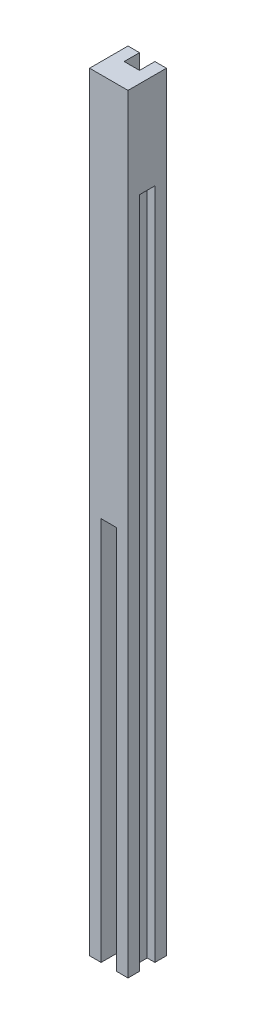
ISO-10303-21;
HEADER;
FILE_DESCRIPTION(('STEP AP214'),'2;1');
FILE_NAME('part.step','',(''),(''),'','','');
FILE_SCHEMA(('AUTOMOTIVE_DESIGN { 1 0 10303 214 1 1 1 1 }'));
ENDSEC;
DATA;
#1=APPLICATION_CONTEXT('core data for automotive mechanical design processes');
#2=APPLICATION_PROTOCOL_DEFINITION('international standard','automotive_design',2000,#1);
#3=PRODUCT_CONTEXT('',#1,'mechanical');
#4=PRODUCT('Part','Part','',(#3));
#5=PRODUCT_RELATED_PRODUCT_CATEGORY('part','',(#4));
#6=PRODUCT_DEFINITION_FORMATION('','',#4);
#7=PRODUCT_DEFINITION_CONTEXT('part definition',#1,'design');
#8=PRODUCT_DEFINITION('design','',#6,#7);
#9=PRODUCT_DEFINITION_SHAPE('','',#8);
#10=(LENGTH_UNIT() NAMED_UNIT(*) SI_UNIT(.MILLI.,.METRE.));
#11=(NAMED_UNIT(*) PLANE_ANGLE_UNIT() SI_UNIT($,.RADIAN.));
#12=(NAMED_UNIT(*) SI_UNIT($,.STERADIAN.) SOLID_ANGLE_UNIT());
#13=UNCERTAINTY_MEASURE_WITH_UNIT(LENGTH_MEASURE(1.E-05),#10,'distance_accuracy_value','');
#14=(GEOMETRIC_REPRESENTATION_CONTEXT(3) GLOBAL_UNCERTAINTY_ASSIGNED_CONTEXT((#13)) GLOBAL_UNIT_ASSIGNED_CONTEXT((#10,
#11,#12)) REPRESENTATION_CONTEXT('',''));
#15=CARTESIAN_POINT('',(0.,0.,0.));
#16=DIRECTION('',(0.,0.,1.));
#17=DIRECTION('',(1.,0.,0.));
#18=AXIS2_PLACEMENT_3D('',#15,#16,#17);
#19=CARTESIAN_POINT('',(0.,0.,0.));
#20=DIRECTION('',(0.,1.,0.));
#21=DIRECTION('',(0.,0.,1.));
#22=AXIS2_PLACEMENT_3D('',#19,#20,#21);
#23=PLANE('',#22);
#24=DIRECTION('',(-1.,0.,0.));
#25=VECTOR('',#24,1.);
#26=CARTESIAN_POINT('',(-23.4918902303552,0.,37.3055599747321));
#27=LINE('',#26,#25);
#28=CARTESIAN_POINT('',(-23.4918902303552,0.,37.3055599747321));
#29=VERTEX_POINT('',#28);
#30=CARTESIAN_POINT('',(-43.4918902303552,0.,37.3055599747321));
#31=VERTEX_POINT('',#30);
#32=EDGE_CURVE('E195',#29,#31,#27,.T.);
#33=ORIENTED_EDGE('',*,*,#32,.F.);
#34=DIRECTION('',(0.,0.,1.));
#35=VECTOR('',#34,1.);
#36=CARTESIAN_POINT('',(-23.4918902303552,0.,-2.69444002526795));
#37=LINE('',#36,#35);
#38=CARTESIAN_POINT('',(-23.4918902303552,0.,-2.69444002526795));
#39=VERTEX_POINT('',#38);
#40=EDGE_CURVE('E181',#39,#29,#37,.T.);
#41=ORIENTED_EDGE('',*,*,#40,.F.);
#42=DIRECTION('',(-1.,0.,0.));
#43=VECTOR('',#42,1.);
#44=CARTESIAN_POINT('',(-23.4918902303552,0.,-2.69444002526795));
#45=LINE('',#44,#43);
#46=CARTESIAN_POINT('',(-43.4918902303552,0.,-2.69444002526795));
#47=VERTEX_POINT('',#46);
#48=EDGE_CURVE('E200',#39,#47,#45,.T.);
#49=ORIENTED_EDGE('',*,*,#48,.T.);
#50=DIRECTION('',(0.,0.,1.));
#51=VECTOR('',#50,1.);
#52=CARTESIAN_POINT('',(-43.4918902303552,0.,-32.6944400252682));
#53=LINE('',#52,#51);
#54=CARTESIAN_POINT('',(-43.4918902303552,0.,-32.6944400252682));
#55=VERTEX_POINT('',#54);
#56=EDGE_CURVE('E295',#55,#47,#53,.T.);
#57=ORIENTED_EDGE('',*,*,#56,.F.);
#58=DIRECTION('',(-1.,0.,0.));
#59=VECTOR('',#58,1.);
#60=CARTESIAN_POINT('',(-43.4918902303552,0.,-32.6944400252682));
#61=LINE('',#60,#59);
#62=CARTESIAN_POINT('',(56.5081097696448,0.,-32.6944400252682));
#63=VERTEX_POINT('',#62);
#64=EDGE_CURVE('E286',#63,#55,#61,.T.);
#65=ORIENTED_EDGE('',*,*,#64,.F.);
#66=DIRECTION('',(0.,0.,-1.));
#67=VECTOR('',#66,1.);
#68=CARTESIAN_POINT('',(56.5081097696448,0.,-32.6944400252682));
#69=LINE('',#68,#67);
#70=CARTESIAN_POINT('',(56.5081097696448,0.,-2.69444002526838));
#71=VERTEX_POINT('',#70);
#72=EDGE_CURVE('E302',#71,#63,#69,.T.);
#73=ORIENTED_EDGE('',*,*,#72,.F.);
#74=DIRECTION('',(1.,0.,0.));
#75=VECTOR('',#74,1.);
#76=CARTESIAN_POINT('',(36.5081097696448,0.,-2.69444002526838));
#77=LINE('',#76,#75);
#78=CARTESIAN_POINT('',(36.5081097696448,0.,-2.69444002526838));
#79=VERTEX_POINT('',#78);
#80=EDGE_CURVE('E221',#79,#71,#77,.T.);
#81=ORIENTED_EDGE('',*,*,#80,.F.);
#82=DIRECTION('',(0.,0.,-1.));
#83=VECTOR('',#82,1.);
#84=CARTESIAN_POINT('',(36.5081097696448,0.,37.3055599747316));
#85=LINE('',#84,#83);
#86=CARTESIAN_POINT('',(36.5081097696448,0.,37.3055599747318));
#87=VERTEX_POINT('',#86);
#88=EDGE_CURVE('E210',#87,#79,#85,.T.);
#89=ORIENTED_EDGE('',*,*,#88,.F.);
#90=DIRECTION('',(1.,0.,0.));
#91=VECTOR('',#90,1.);
#92=CARTESIAN_POINT('',(36.5081097696448,0.,37.3055599747316));
#93=LINE('',#92,#91);
#94=CARTESIAN_POINT('',(56.5081097696448,0.,37.3055599747316));
#95=VERTEX_POINT('',#94);
#96=EDGE_CURVE('E218',#87,#95,#93,.T.);
#97=ORIENTED_EDGE('',*,*,#96,.T.);
#98=CARTESIAN_POINT('',(56.5081097696448,0.,67.3055599747318));
#99=VERTEX_POINT('',#98);
#100=EDGE_CURVE('E303',#99,#95,#69,.T.);
#101=ORIENTED_EDGE('',*,*,#100,.F.);
#102=DIRECTION('',(1.,0.,0.));
#103=VECTOR('',#102,1.);
#104=CARTESIAN_POINT('',(-43.4918902303552,0.,67.3055599747318));
#105=LINE('',#104,#103);
#106=CARTESIAN_POINT('',(26.508109769645,0.,67.3055599747318));
#107=VERTEX_POINT('',#106);
#108=EDGE_CURVE('E298',#107,#99,#105,.T.);
#109=ORIENTED_EDGE('',*,*,#108,.F.);
#110=DIRECTION('',(0.,0.,1.));
#111=VECTOR('',#110,1.);
#112=CARTESIAN_POINT('',(26.508109769645,0.,27.3055599747318));
#113=LINE('',#112,#111);
#114=CARTESIAN_POINT('',(26.508109769645,0.,27.3055599747318));
#115=VERTEX_POINT('',#114);
#116=EDGE_CURVE('E278',#115,#107,#113,.T.);
#117=ORIENTED_EDGE('',*,*,#116,.F.);
#118=DIRECTION('',(1.,0.,0.));
#119=VECTOR('',#118,1.);
#120=CARTESIAN_POINT('',(-13.491890230355,0.,27.3055599747318));
#121=LINE('',#120,#119);
#122=CARTESIAN_POINT('',(-13.4918902303552,0.,27.3055599747318));
#123=VERTEX_POINT('',#122);
#124=EDGE_CURVE('E258',#123,#115,#121,.T.);
#125=ORIENTED_EDGE('',*,*,#124,.F.);
#126=DIRECTION('',(0.,0.,1.));
#127=VECTOR('',#126,1.);
#128=CARTESIAN_POINT('',(-13.491890230355,0.,27.3055599747318));
#129=LINE('',#128,#127);
#130=CARTESIAN_POINT('',(-13.491890230355,0.,67.3055599747318));
#131=VERTEX_POINT('',#130);
#132=EDGE_CURVE('E266',#123,#131,#129,.T.);
#133=ORIENTED_EDGE('',*,*,#132,.T.);
#134=CARTESIAN_POINT('',(-43.4918902303552,0.,67.3055599747318));
#135=VERTEX_POINT('',#134);
#136=EDGE_CURVE('E299',#135,#131,#105,.T.);
#137=ORIENTED_EDGE('',*,*,#136,.F.);
#138=EDGE_CURVE('E275',#31,#135,#53,.T.);
#139=ORIENTED_EDGE('',*,*,#138,.F.);
#140=EDGE_LOOP('',(#33,#41,#49,#57,#65,#73,#81,#89,#97,#101,#109,#117,#125,#133,#137,#139));
#141=FACE_BOUND('',#140,.T.);
#142=ADVANCED_FACE('F34',(#141),#23,.F.);
#143=CARTESIAN_POINT('',(-43.4918902303552,2000.,-32.6944400252682));
#144=DIRECTION('',(1.,0.,0.));
#145=DIRECTION('',(0.,0.,-1.));
#146=AXIS2_PLACEMENT_3D('',#143,#144,#145);
#147=PLANE('',#146);
#148=DIRECTION('',(0.,-1.,0.));
#149=VECTOR('',#148,1.);
#150=CARTESIAN_POINT('',(-43.4918902303552,1750.,37.3055599747318));
#151=LINE('',#150,#149);
#152=CARTESIAN_POINT('',(-43.4918902303552,1750.,37.3055599747318));
#153=VERTEX_POINT('',#152);
#154=EDGE_CURVE('E193',#153,#31,#151,.T.);
#155=ORIENTED_EDGE('',*,*,#154,.T.);
#156=ORIENTED_EDGE('',*,*,#138,.T.);
#157=DIRECTION('',(0.,-1.,0.));
#158=VECTOR('',#157,1.);
#159=CARTESIAN_POINT('',(-43.4918902303552,2000.,67.3055599747318));
#160=LINE('',#159,#158);
#161=CARTESIAN_POINT('',(-43.4918902303552,2000.,67.3055599747318));
#162=VERTEX_POINT('',#161);
#163=EDGE_CURVE('E11',#162,#135,#160,.T.);
#164=ORIENTED_EDGE('',*,*,#163,.F.);
#165=DIRECTION('',(0.,0.,1.));
#166=VECTOR('',#165,1.);
#167=CARTESIAN_POINT('',(-43.4918902303552,2000.,-32.6944400252682));
#168=LINE('',#167,#166);
#169=CARTESIAN_POINT('',(-43.4918902303552,2000.,-32.6944400252682));
#170=VERTEX_POINT('',#169);
#171=EDGE_CURVE('E282',#170,#162,#168,.T.);
#172=ORIENTED_EDGE('',*,*,#171,.F.);
#173=DIRECTION('',(0.,-1.,0.));
#174=VECTOR('',#173,1.);
#175=CARTESIAN_POINT('',(-43.4918902303552,2000.,-32.6944400252682));
#176=LINE('',#175,#174);
#177=EDGE_CURVE('E294',#170,#55,#176,.T.);
#178=ORIENTED_EDGE('',*,*,#177,.T.);
#179=ORIENTED_EDGE('',*,*,#56,.T.);
#180=DIRECTION('',(0.,-1.,0.));
#181=VECTOR('',#180,1.);
#182=CARTESIAN_POINT('',(-43.4918902303552,1750.,-2.69444002526816));
#183=LINE('',#182,#181);
#184=CARTESIAN_POINT('',(-43.4918902303552,1750.,-2.69444002526816));
#185=VERTEX_POINT('',#184);
#186=EDGE_CURVE('E189',#185,#47,#183,.T.);
#187=ORIENTED_EDGE('',*,*,#186,.F.);
#188=DIRECTION('',(0.,0.,1.));
#189=VECTOR('',#188,1.);
#190=CARTESIAN_POINT('',(-43.4918902303552,1750.,-2.69444002526816));
#191=LINE('',#190,#189);
#192=EDGE_CURVE('E49',#185,#153,#191,.T.);
#193=ORIENTED_EDGE('',*,*,#192,.T.);
#194=EDGE_LOOP('',(#155,#156,#164,#172,#178,#179,#187,#193));
#195=FACE_BOUND('',#194,.T.);
#196=ADVANCED_FACE('F36',(#195),#147,.F.);
#197=CARTESIAN_POINT('',(56.5081097696448,2000.,-32.6944400252682));
#198=DIRECTION('',(-1.,0.,0.));
#199=DIRECTION('',(0.,0.,1.));
#200=AXIS2_PLACEMENT_3D('',#197,#198,#199);
#201=PLANE('',#200);
#202=DIRECTION('',(0.,-1.,0.));
#203=VECTOR('',#202,1.);
#204=CARTESIAN_POINT('',(56.5081097696448,1750.,-2.69444002526817));
#205=LINE('',#204,#203);
#206=CARTESIAN_POINT('',(56.5081097696448,1750.,-2.69444002526817));
#207=VERTEX_POINT('',#206);
#208=EDGE_CURVE('E198',#207,#71,#205,.T.);
#209=ORIENTED_EDGE('',*,*,#208,.T.);
#210=ORIENTED_EDGE('',*,*,#72,.T.);
#211=DIRECTION('',(0.,-1.,0.));
#212=VECTOR('',#211,1.);
#213=CARTESIAN_POINT('',(56.5081097696448,2000.,-32.6944400252682));
#214=LINE('',#213,#212);
#215=CARTESIAN_POINT('',(56.5081097696448,2000.,-32.6944400252682));
#216=VERTEX_POINT('',#215);
#217=EDGE_CURVE('E309',#216,#63,#214,.T.);
#218=ORIENTED_EDGE('',*,*,#217,.F.);
#219=DIRECTION('',(0.,0.,-1.));
#220=VECTOR('',#219,1.);
#221=CARTESIAN_POINT('',(56.5081097696448,2000.,-32.6944400252682));
#222=LINE('',#221,#220);
#223=CARTESIAN_POINT('',(56.5081097696448,2000.,67.3055599747318));
#224=VERTEX_POINT('',#223);
#225=EDGE_CURVE('E288',#224,#216,#222,.T.);
#226=ORIENTED_EDGE('',*,*,#225,.F.);
#227=DIRECTION('',(0.,-1.,0.));
#228=VECTOR('',#227,1.);
#229=CARTESIAN_POINT('',(56.5081097696448,2000.,67.3055599747318));
#230=LINE('',#229,#228);
#231=EDGE_CURVE('E42',#224,#99,#230,.T.);
#232=ORIENTED_EDGE('',*,*,#231,.T.);
#233=ORIENTED_EDGE('',*,*,#100,.T.);
#234=DIRECTION('',(0.,-1.,0.));
#235=VECTOR('',#234,1.);
#236=CARTESIAN_POINT('',(56.5081097696448,1750.,37.3055599747318));
#237=LINE('',#236,#235);
#238=CARTESIAN_POINT('',(56.5081097696448,1750.,37.3055599747318));
#239=VERTEX_POINT('',#238);
#240=EDGE_CURVE('E208',#239,#95,#237,.T.);
#241=ORIENTED_EDGE('',*,*,#240,.F.);
#242=DIRECTION('',(0.,0.,-1.));
#243=VECTOR('',#242,1.);
#244=CARTESIAN_POINT('',(56.5081097696448,1750.,37.3055599747318));
#245=LINE('',#244,#243);
#246=EDGE_CURVE('E194',#239,#207,#245,.T.);
#247=ORIENTED_EDGE('',*,*,#246,.T.);
#248=EDGE_LOOP('',(#209,#210,#218,#226,#232,#233,#241,#247));
#249=FACE_BOUND('',#248,.T.);
#250=ADVANCED_FACE('F316',(#249),#201,.F.);
#251=CARTESIAN_POINT('',(-43.4918902303552,2000.,67.3055599747318));
#252=DIRECTION('',(0.,0.,-1.));
#253=DIRECTION('',(-1.,0.,0.));
#254=AXIS2_PLACEMENT_3D('',#251,#252,#253);
#255=PLANE('',#254);
#256=ORIENTED_EDGE('',*,*,#136,.T.);
#257=DIRECTION('',(0.,-1.,0.));
#258=VECTOR('',#257,1.);
#259=CARTESIAN_POINT('',(-13.4918902303552,1000.,67.3055599747318));
#260=LINE('',#259,#258);
#261=CARTESIAN_POINT('',(-13.4918902303552,1000.,67.3055599747318));
#262=VERTEX_POINT('',#261);
#263=EDGE_CURVE('E249',#262,#131,#260,.T.);
#264=ORIENTED_EDGE('',*,*,#263,.F.);
#265=DIRECTION('',(1.,0.,0.));
#266=VECTOR('',#265,1.);
#267=CARTESIAN_POINT('',(-13.4918902303552,1000.,67.3055599747318));
#268=LINE('',#267,#266);
#269=CARTESIAN_POINT('',(26.5081097696449,1000.,67.3055599747318));
#270=VERTEX_POINT('',#269);
#271=EDGE_CURVE('E259',#262,#270,#268,.T.);
#272=ORIENTED_EDGE('',*,*,#271,.T.);
#273=DIRECTION('',(0.,-1.,0.));
#274=VECTOR('',#273,1.);
#275=CARTESIAN_POINT('',(26.5081097696449,1000.,67.3055599747318));
#276=LINE('',#275,#274);
#277=EDGE_CURVE('E268',#270,#107,#276,.T.);
#278=ORIENTED_EDGE('',*,*,#277,.T.);
#279=ORIENTED_EDGE('',*,*,#108,.T.);
#280=ORIENTED_EDGE('',*,*,#231,.F.);
#281=DIRECTION('',(1.,0.,0.));
#282=VECTOR('',#281,1.);
#283=CARTESIAN_POINT('',(-43.4918902303552,2000.,67.3055599747318));
#284=LINE('',#283,#282);
#285=EDGE_CURVE('E285',#162,#224,#284,.T.);
#286=ORIENTED_EDGE('',*,*,#285,.F.);
#287=ORIENTED_EDGE('',*,*,#163,.T.);
#288=EDGE_LOOP('',(#256,#264,#272,#278,#279,#280,#286,#287));
#289=FACE_BOUND('',#288,.T.);
#290=ADVANCED_FACE('F347',(#289),#255,.F.);
#291=CARTESIAN_POINT('',(-43.4918902303552,2000.,-32.6944400252682));
#292=DIRECTION('',(0.,0.,1.));
#293=DIRECTION('',(1.,0.,0.));
#294=AXIS2_PLACEMENT_3D('',#291,#292,#293);
#295=PLANE('',#294);
#296=DIRECTION('',(-1.,0.,0.));
#297=VECTOR('',#296,1.);
#298=CARTESIAN_POINT('',(26.5081097696447,1000.,-32.6944400252682));
#299=LINE('',#298,#297);
#300=CARTESIAN_POINT('',(26.5081097696447,1000.,-32.6944400252682));
#301=VERTEX_POINT('',#300);
#302=CARTESIAN_POINT('',(-13.4918902303553,1000.,-32.6944400252682));
#303=VERTEX_POINT('',#302);
#304=EDGE_CURVE('E226',#301,#303,#299,.T.);
#305=ORIENTED_EDGE('',*,*,#304,.F.);
#306=DIRECTION('',(0.,-1.,0.));
#307=VECTOR('',#306,1.);
#308=CARTESIAN_POINT('',(26.5081097696448,2000.,-32.6944400252682));
#309=LINE('',#308,#307);
#310=CARTESIAN_POINT('',(26.5081097696448,2000.,-32.6944400252682));
#311=VERTEX_POINT('',#310);
#312=EDGE_CURVE('E231',#311,#301,#309,.T.);
#313=ORIENTED_EDGE('',*,*,#312,.F.);
#314=DIRECTION('',(-1.,0.,0.));
#315=VECTOR('',#314,1.);
#316=CARTESIAN_POINT('',(-43.4918902303552,2000.,-32.6944400252682));
#317=LINE('',#316,#315);
#318=EDGE_CURVE('E291',#216,#311,#317,.T.);
#319=ORIENTED_EDGE('',*,*,#318,.F.);
#320=ORIENTED_EDGE('',*,*,#217,.T.);
#321=ORIENTED_EDGE('',*,*,#64,.T.);
#322=ORIENTED_EDGE('',*,*,#177,.F.);
#323=CARTESIAN_POINT('',(-13.4918902303552,2000.,-32.6944400252682));
#324=VERTEX_POINT('',#323);
#325=EDGE_CURVE('E290',#324,#170,#317,.T.);
#326=ORIENTED_EDGE('',*,*,#325,.F.);
#327=DIRECTION('',(0.,-1.,0.));
#328=VECTOR('',#327,1.);
#329=CARTESIAN_POINT('',(-13.4918902303552,2000.,-32.6944400252682));
#330=LINE('',#329,#328);
#331=EDGE_CURVE('E242',#324,#303,#330,.T.);
#332=ORIENTED_EDGE('',*,*,#331,.T.);
#333=EDGE_LOOP('',(#305,#313,#319,#320,#321,#322,#326,#332));
#334=FACE_BOUND('',#333,.T.);
#335=ADVANCED_FACE('F339',(#334),#295,.F.);
#336=CARTESIAN_POINT('',(0.,2000.,0.));
#337=DIRECTION('',(0.,1.,0.));
#338=DIRECTION('',(0.,0.,1.));
#339=AXIS2_PLACEMENT_3D('',#336,#337,#338);
#340=PLANE('',#339);
#341=DIRECTION('',(0.,0.,-1.));
#342=VECTOR('',#341,1.);
#343=CARTESIAN_POINT('',(26.5081097696448,2000.,7.30555997473184));
#344=LINE('',#343,#342);
#345=CARTESIAN_POINT('',(26.5081097696448,2000.,7.30555997473184));
#346=VERTEX_POINT('',#345);
#347=EDGE_CURVE('E250',#346,#311,#344,.T.);
#348=ORIENTED_EDGE('',*,*,#347,.F.);
#349=DIRECTION('',(-1.,0.,0.));
#350=VECTOR('',#349,1.);
#351=CARTESIAN_POINT('',(26.5081097696448,2000.,7.30555997473184));
#352=LINE('',#351,#350);
#353=CARTESIAN_POINT('',(-13.4918902303553,2000.,7.30555997473184));
#354=VERTEX_POINT('',#353);
#355=EDGE_CURVE('E233',#346,#354,#352,.T.);
#356=ORIENTED_EDGE('',*,*,#355,.T.);
#357=DIRECTION('',(0.,0.,-1.));
#358=VECTOR('',#357,1.);
#359=CARTESIAN_POINT('',(-13.4918902303552,2000.,7.30555997473184));
#360=LINE('',#359,#358);
#361=EDGE_CURVE('E252',#354,#324,#360,.T.);
#362=ORIENTED_EDGE('',*,*,#361,.T.);
#363=ORIENTED_EDGE('',*,*,#325,.T.);
#364=ORIENTED_EDGE('',*,*,#171,.T.);
#365=ORIENTED_EDGE('',*,*,#285,.T.);
#366=ORIENTED_EDGE('',*,*,#225,.T.);
#367=ORIENTED_EDGE('',*,*,#318,.T.);
#368=EDGE_LOOP('',(#348,#356,#362,#363,#364,#365,#366,#367));
#369=FACE_BOUND('',#368,.T.);
#370=ADVANCED_FACE('F344',(#369),#340,.T.);
#371=CARTESIAN_POINT('',(-13.4918902303552,1000.,27.3055599747318));
#372=DIRECTION('',(-1.,0.,0.));
#373=DIRECTION('',(0.,-1.,0.));
#374=AXIS2_PLACEMENT_3D('',#371,#372,#373);
#375=PLANE('',#374);
#376=ORIENTED_EDGE('',*,*,#263,.T.);
#377=ORIENTED_EDGE('',*,*,#132,.F.);
#378=DIRECTION('',(0.,-1.,0.));
#379=VECTOR('',#378,1.);
#380=CARTESIAN_POINT('',(-13.4918902303552,1000.,27.3055599747318));
#381=LINE('',#380,#379);
#382=CARTESIAN_POINT('',(-13.4918902303552,1000.,27.3055599747318));
#383=VERTEX_POINT('',#382);
#384=EDGE_CURVE('E256',#383,#123,#381,.T.);
#385=ORIENTED_EDGE('',*,*,#384,.F.);
#386=DIRECTION('',(0.,0.,1.));
#387=VECTOR('',#386,1.);
#388=CARTESIAN_POINT('',(-13.4918902303552,1000.,27.3055599747318));
#389=LINE('',#388,#387);
#390=EDGE_CURVE('E273',#383,#262,#389,.T.);
#391=ORIENTED_EDGE('',*,*,#390,.T.);
#392=EDGE_LOOP('',(#376,#377,#385,#391));
#393=FACE_BOUND('',#392,.T.);
#394=ADVANCED_FACE('F356',(#393),#375,.F.);
#395=CARTESIAN_POINT('',(-13.4918902303552,1000.,27.3055599747318));
#396=DIRECTION('',(0.,-1.,0.));
#397=DIRECTION('',(0.,0.,-1.));
#398=AXIS2_PLACEMENT_3D('',#395,#396,#397);
#399=PLANE('',#398);
#400=ORIENTED_EDGE('',*,*,#271,.F.);
#401=ORIENTED_EDGE('',*,*,#390,.F.);
#402=DIRECTION('',(1.,0.,0.));
#403=VECTOR('',#402,1.);
#404=CARTESIAN_POINT('',(-13.4918902303552,1000.,27.3055599747318));
#405=LINE('',#404,#403);
#406=CARTESIAN_POINT('',(26.5081097696449,1000.,27.3055599747318));
#407=VERTEX_POINT('',#406);
#408=EDGE_CURVE('E264',#383,#407,#405,.T.);
#409=ORIENTED_EDGE('',*,*,#408,.T.);
#410=DIRECTION('',(0.,0.,1.));
#411=VECTOR('',#410,1.);
#412=CARTESIAN_POINT('',(26.5081097696449,1000.,27.3055599747318));
#413=LINE('',#412,#411);
#414=EDGE_CURVE('E276',#407,#270,#413,.T.);
#415=ORIENTED_EDGE('',*,*,#414,.T.);
#416=EDGE_LOOP('',(#400,#401,#409,#415));
#417=FACE_BOUND('',#416,.T.);
#418=ADVANCED_FACE('F360',(#417),#399,.T.);
#419=CARTESIAN_POINT('',(26.5081097696449,1000.,27.3055599747318));
#420=DIRECTION('',(-1.,0.,0.));
#421=DIRECTION('',(0.,-1.,0.));
#422=AXIS2_PLACEMENT_3D('',#419,#420,#421);
#423=PLANE('',#422);
#424=ORIENTED_EDGE('',*,*,#277,.F.);
#425=ORIENTED_EDGE('',*,*,#414,.F.);
#426=DIRECTION('',(0.,-1.,0.));
#427=VECTOR('',#426,1.);
#428=CARTESIAN_POINT('',(26.5081097696449,1000.,27.3055599747318));
#429=LINE('',#428,#427);
#430=EDGE_CURVE('E262',#407,#115,#429,.T.);
#431=ORIENTED_EDGE('',*,*,#430,.T.);
#432=ORIENTED_EDGE('',*,*,#116,.T.);
#433=EDGE_LOOP('',(#424,#425,#431,#432));
#434=FACE_BOUND('',#433,.T.);
#435=ADVANCED_FACE('F365',(#434),#423,.T.);
#436=CARTESIAN_POINT('',(0.,0.,27.3055599747318));
#437=DIRECTION('',(0.,0.,1.));
#438=DIRECTION('',(1.,0.,0.));
#439=AXIS2_PLACEMENT_3D('',#436,#437,#438);
#440=PLANE('',#439);
#441=ORIENTED_EDGE('',*,*,#384,.T.);
#442=ORIENTED_EDGE('',*,*,#124,.T.);
#443=ORIENTED_EDGE('',*,*,#430,.F.);
#444=ORIENTED_EDGE('',*,*,#408,.F.);
#445=EDGE_LOOP('',(#441,#442,#443,#444));
#446=FACE_BOUND('',#445,.T.);
#447=ADVANCED_FACE('F367',(#446),#440,.T.);
#448=CARTESIAN_POINT('',(26.5081097696447,1000.,7.30555997473184));
#449=DIRECTION('',(0.,-1.,0.));
#450=DIRECTION('',(0.,0.,-1.));
#451=AXIS2_PLACEMENT_3D('',#448,#449,#450);
#452=PLANE('',#451);
#453=ORIENTED_EDGE('',*,*,#304,.T.);
#454=DIRECTION('',(0.,0.,-1.));
#455=VECTOR('',#454,1.);
#456=CARTESIAN_POINT('',(-13.4918902303553,1000.,7.30555997473184));
#457=LINE('',#456,#455);
#458=CARTESIAN_POINT('',(-13.4918902303553,1000.,7.30555997473184));
#459=VERTEX_POINT('',#458);
#460=EDGE_CURVE('E239',#459,#303,#457,.T.);
#461=ORIENTED_EDGE('',*,*,#460,.F.);
#462=DIRECTION('',(-1.,0.,0.));
#463=VECTOR('',#462,1.);
#464=CARTESIAN_POINT('',(26.5081097696447,1000.,7.30555997473184));
#465=LINE('',#464,#463);
#466=CARTESIAN_POINT('',(26.5081097696447,1000.,7.30555997473184));
#467=VERTEX_POINT('',#466);
#468=EDGE_CURVE('E227',#467,#459,#465,.T.);
#469=ORIENTED_EDGE('',*,*,#468,.F.);
#470=DIRECTION('',(0.,0.,-1.));
#471=VECTOR('',#470,1.);
#472=CARTESIAN_POINT('',(26.5081097696447,1000.,7.30555997473184));
#473=LINE('',#472,#471);
#474=EDGE_CURVE('E247',#467,#301,#473,.T.);
#475=ORIENTED_EDGE('',*,*,#474,.T.);
#476=EDGE_LOOP('',(#453,#461,#469,#475));
#477=FACE_BOUND('',#476,.T.);
#478=ADVANCED_FACE('F369',(#477),#452,.F.);
#479=CARTESIAN_POINT('',(26.5081097696448,2000.,7.30555997473184));
#480=DIRECTION('',(1.,0.,0.));
#481=DIRECTION('',(0.,1.,0.));
#482=AXIS2_PLACEMENT_3D('',#479,#480,#481);
#483=PLANE('',#482);
#484=ORIENTED_EDGE('',*,*,#312,.T.);
#485=ORIENTED_EDGE('',*,*,#474,.F.);
#486=DIRECTION('',(0.,-1.,0.));
#487=VECTOR('',#486,1.);
#488=CARTESIAN_POINT('',(26.5081097696448,2000.,7.30555997473184));
#489=LINE('',#488,#487);
#490=EDGE_CURVE('E236',#346,#467,#489,.T.);
#491=ORIENTED_EDGE('',*,*,#490,.F.);
#492=ORIENTED_EDGE('',*,*,#347,.T.);
#493=EDGE_LOOP('',(#484,#485,#491,#492));
#494=FACE_BOUND('',#493,.T.);
#495=ADVANCED_FACE('F375',(#494),#483,.F.);
#496=CARTESIAN_POINT('',(-13.4918902303552,2000.,7.30555997473184));
#497=DIRECTION('',(1.,0.,0.));
#498=DIRECTION('',(0.,1.,0.));
#499=AXIS2_PLACEMENT_3D('',#496,#497,#498);
#500=PLANE('',#499);
#501=ORIENTED_EDGE('',*,*,#331,.F.);
#502=ORIENTED_EDGE('',*,*,#361,.F.);
#503=DIRECTION('',(0.,-1.,0.));
#504=VECTOR('',#503,1.);
#505=CARTESIAN_POINT('',(-13.4918902303552,2000.,7.30555997473184));
#506=LINE('',#505,#504);
#507=EDGE_CURVE('E230',#354,#459,#506,.T.);
#508=ORIENTED_EDGE('',*,*,#507,.T.);
#509=ORIENTED_EDGE('',*,*,#460,.T.);
#510=EDGE_LOOP('',(#501,#502,#508,#509));
#511=FACE_BOUND('',#510,.T.);
#512=ADVANCED_FACE('F441',(#511),#500,.T.);
#513=CARTESIAN_POINT('',(0.,0.,7.30555997473184));
#514=DIRECTION('',(0.,0.,1.));
#515=DIRECTION('',(1.,0.,0.));
#516=AXIS2_PLACEMENT_3D('',#513,#514,#515);
#517=PLANE('',#516);
#518=ORIENTED_EDGE('',*,*,#468,.T.);
#519=ORIENTED_EDGE('',*,*,#507,.F.);
#520=ORIENTED_EDGE('',*,*,#355,.F.);
#521=ORIENTED_EDGE('',*,*,#490,.T.);
#522=EDGE_LOOP('',(#518,#519,#520,#521));
#523=FACE_BOUND('',#522,.T.);
#524=ADVANCED_FACE('F450',(#523),#517,.F.);
#525=CARTESIAN_POINT('',(36.5081097696448,1750.,37.3055599747318));
#526=DIRECTION('',(0.,-1.,0.));
#527=DIRECTION('',(0.,0.,-1.));
#528=AXIS2_PLACEMENT_3D('',#525,#526,#527);
#529=PLANE('',#528);
#530=ORIENTED_EDGE('',*,*,#246,.F.);
#531=DIRECTION('',(1.,0.,0.));
#532=VECTOR('',#531,1.);
#533=CARTESIAN_POINT('',(36.5081097696448,1750.,37.3055599747318));
#534=LINE('',#533,#532);
#535=CARTESIAN_POINT('',(36.5081097696448,1750.,37.3055599747318));
#536=VERTEX_POINT('',#535);
#537=EDGE_CURVE('E212',#536,#239,#534,.T.);
#538=ORIENTED_EDGE('',*,*,#537,.F.);
#539=DIRECTION('',(0.,0.,-1.));
#540=VECTOR('',#539,1.);
#541=CARTESIAN_POINT('',(36.5081097696448,1750.,37.3055599747318));
#542=LINE('',#541,#540);
#543=CARTESIAN_POINT('',(36.5081097696448,1750.,-2.69444002526816));
#544=VERTEX_POINT('',#543);
#545=EDGE_CURVE('E204',#536,#544,#542,.T.);
#546=ORIENTED_EDGE('',*,*,#545,.T.);
#547=DIRECTION('',(1.,0.,0.));
#548=VECTOR('',#547,1.);
#549=CARTESIAN_POINT('',(36.5081097696448,1750.,-2.69444002526816));
#550=LINE('',#549,#548);
#551=EDGE_CURVE('E223',#544,#207,#550,.T.);
#552=ORIENTED_EDGE('',*,*,#551,.T.);
#553=EDGE_LOOP('',(#530,#538,#546,#552));
#554=FACE_BOUND('',#553,.T.);
#555=ADVANCED_FACE('F330',(#554),#529,.T.);
#556=CARTESIAN_POINT('',(36.5081097696448,1750.,-2.69444002526816));
#557=DIRECTION('',(0.,0.,1.));
#558=DIRECTION('',(0.,-1.,0.));
#559=AXIS2_PLACEMENT_3D('',#556,#557,#558);
#560=PLANE('',#559);
#561=ORIENTED_EDGE('',*,*,#208,.F.);
#562=ORIENTED_EDGE('',*,*,#551,.F.);
#563=DIRECTION('',(0.,-1.,0.));
#564=VECTOR('',#563,1.);
#565=CARTESIAN_POINT('',(36.5081097696448,1750.,-2.69444002526816));
#566=LINE('',#565,#564);
#567=EDGE_CURVE('E207',#544,#79,#566,.T.);
#568=ORIENTED_EDGE('',*,*,#567,.T.);
#569=ORIENTED_EDGE('',*,*,#80,.T.);
#570=EDGE_LOOP('',(#561,#562,#568,#569));
#571=FACE_BOUND('',#570,.T.);
#572=ADVANCED_FACE('F333',(#571),#560,.T.);
#573=CARTESIAN_POINT('',(36.5081097696448,1750.,37.3055599747318));
#574=DIRECTION('',(0.,0.,1.));
#575=DIRECTION('',(0.,-1.,0.));
#576=AXIS2_PLACEMENT_3D('',#573,#574,#575);
#577=PLANE('',#576);
#578=ORIENTED_EDGE('',*,*,#240,.T.);
#579=ORIENTED_EDGE('',*,*,#96,.F.);
#580=DIRECTION('',(0.,-1.,0.));
#581=VECTOR('',#580,1.);
#582=CARTESIAN_POINT('',(36.5081097696448,1750.,37.3055599747318));
#583=LINE('',#582,#581);
#584=EDGE_CURVE('E57',#536,#87,#583,.T.);
#585=ORIENTED_EDGE('',*,*,#584,.F.);
#586=ORIENTED_EDGE('',*,*,#537,.T.);
#587=EDGE_LOOP('',(#578,#579,#585,#586));
#588=FACE_BOUND('',#587,.T.);
#589=ADVANCED_FACE('F326',(#588),#577,.F.);
#590=CARTESIAN_POINT('',(36.5081097696448,0.,0.));
#591=DIRECTION('',(-1.,0.,0.));
#592=DIRECTION('',(0.,0.,1.));
#593=AXIS2_PLACEMENT_3D('',#590,#591,#592);
#594=PLANE('',#593);
#595=ORIENTED_EDGE('',*,*,#545,.F.);
#596=ORIENTED_EDGE('',*,*,#584,.T.);
#597=ORIENTED_EDGE('',*,*,#88,.T.);
#598=ORIENTED_EDGE('',*,*,#567,.F.);
#599=EDGE_LOOP('',(#595,#596,#597,#598));
#600=FACE_BOUND('',#599,.T.);
#601=ADVANCED_FACE('F488',(#600),#594,.F.);
#602=CARTESIAN_POINT('',(-23.4918902303552,1750.,-2.69444002526816));
#603=DIRECTION('',(0.,-1.,0.));
#604=DIRECTION('',(0.,0.,-1.));
#605=AXIS2_PLACEMENT_3D('',#602,#603,#604);
#606=PLANE('',#605);
#607=ORIENTED_EDGE('',*,*,#192,.F.);
#608=DIRECTION('',(-1.,0.,0.));
#609=VECTOR('',#608,1.);
#610=CARTESIAN_POINT('',(-23.4918902303552,1750.,-2.69444002526816));
#611=LINE('',#610,#609);
#612=CARTESIAN_POINT('',(-23.4918902303552,1750.,-2.69444002526816));
#613=VERTEX_POINT('',#612);
#614=EDGE_CURVE('E188',#613,#185,#611,.T.);
#615=ORIENTED_EDGE('',*,*,#614,.F.);
#616=DIRECTION('',(0.,0.,1.));
#617=VECTOR('',#616,1.);
#618=CARTESIAN_POINT('',(-23.4918902303552,1750.,-2.69444002526816));
#619=LINE('',#618,#617);
#620=CARTESIAN_POINT('',(-23.4918902303552,1750.,37.3055599747318));
#621=VERTEX_POINT('',#620);
#622=EDGE_CURVE('E178',#613,#621,#619,.T.);
#623=ORIENTED_EDGE('',*,*,#622,.T.);
#624=DIRECTION('',(-1.,0.,0.));
#625=VECTOR('',#624,1.);
#626=CARTESIAN_POINT('',(-23.4918902303552,1750.,37.3055599747318));
#627=LINE('',#626,#625);
#628=EDGE_CURVE('E187',#621,#153,#627,.T.);
#629=ORIENTED_EDGE('',*,*,#628,.T.);
#630=EDGE_LOOP('',(#607,#615,#623,#629));
#631=FACE_BOUND('',#630,.T.);
#632=ADVANCED_FACE('F186',(#631),#606,.T.);
#633=CARTESIAN_POINT('',(-23.4918902303552,1750.,37.3055599747318));
#634=DIRECTION('',(0.,0.,-1.));
#635=DIRECTION('',(-1.,0.,0.));
#636=AXIS2_PLACEMENT_3D('',#633,#634,#635);
#637=PLANE('',#636);
#638=ORIENTED_EDGE('',*,*,#154,.F.);
#639=ORIENTED_EDGE('',*,*,#628,.F.);
#640=DIRECTION('',(0.,-1.,0.));
#641=VECTOR('',#640,1.);
#642=CARTESIAN_POINT('',(-23.4918902303552,1750.,37.3055599747318));
#643=LINE('',#642,#641);
#644=EDGE_CURVE('E174',#621,#29,#643,.T.);
#645=ORIENTED_EDGE('',*,*,#644,.T.);
#646=ORIENTED_EDGE('',*,*,#32,.T.);
#647=EDGE_LOOP('',(#638,#639,#645,#646));
#648=FACE_BOUND('',#647,.T.);
#649=ADVANCED_FACE('F191',(#648),#637,.T.);
#650=CARTESIAN_POINT('',(-23.4918902303552,1750.,-2.69444002526816));
#651=DIRECTION('',(0.,0.,-1.));
#652=DIRECTION('',(-1.,0.,0.));
#653=AXIS2_PLACEMENT_3D('',#650,#651,#652);
#654=PLANE('',#653);
#655=ORIENTED_EDGE('',*,*,#186,.T.);
#656=ORIENTED_EDGE('',*,*,#48,.F.);
#657=DIRECTION('',(0.,-1.,0.));
#658=VECTOR('',#657,1.);
#659=CARTESIAN_POINT('',(-23.4918902303552,1750.,-2.69444002526816));
#660=LINE('',#659,#658);
#661=EDGE_CURVE('E551',#613,#39,#660,.T.);
#662=ORIENTED_EDGE('',*,*,#661,.F.);
#663=ORIENTED_EDGE('',*,*,#614,.T.);
#664=EDGE_LOOP('',(#655,#656,#662,#663));
#665=FACE_BOUND('',#664,.T.);
#666=ADVANCED_FACE('F518',(#665),#654,.F.);
#667=CARTESIAN_POINT('',(-23.4918902303552,0.,0.));
#668=DIRECTION('',(1.,0.,0.));
#669=DIRECTION('',(0.,0.,-1.));
#670=AXIS2_PLACEMENT_3D('',#667,#668,#669);
#671=PLANE('',#670);
#672=ORIENTED_EDGE('',*,*,#622,.F.);
#673=ORIENTED_EDGE('',*,*,#661,.T.);
#674=ORIENTED_EDGE('',*,*,#40,.T.);
#675=ORIENTED_EDGE('',*,*,#644,.F.);
#676=EDGE_LOOP('',(#672,#673,#674,#675));
#677=FACE_BOUND('',#676,.T.);
#678=ADVANCED_FACE('F176',(#677),#671,.F.);
#679=CLOSED_SHELL('',(#142,#196,#250,#290,#335,#370,#394,#418,#435,#447,#478,#495,#512,#524,
#555,#572,#589,#601,#632,#649,#666,#678));
#680=MANIFOLD_SOLID_BREP('B2',#679);
#681=ADVANCED_BREP_SHAPE_REPRESENTATION('',(#18,#680),#14);
#682=SHAPE_DEFINITION_REPRESENTATION(#9,#681);
ENDSEC;
END-ISO-10303-21;
